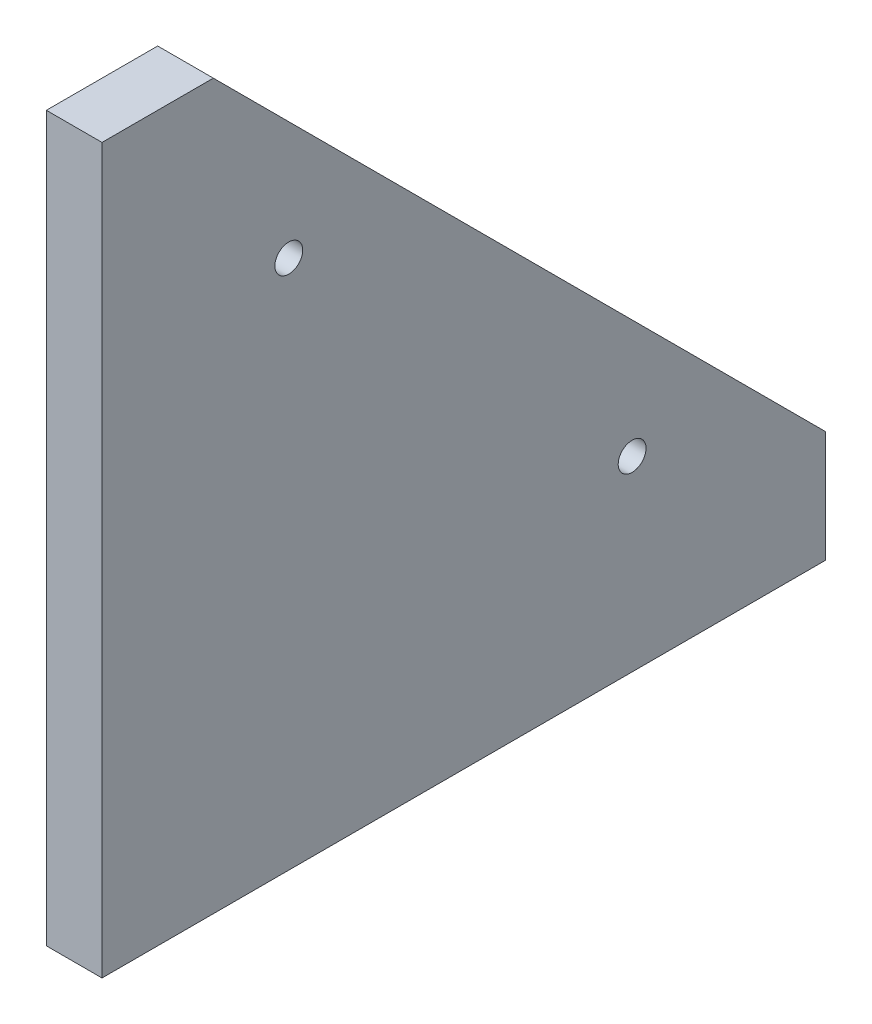
ISO-10303-21;
HEADER;
FILE_DESCRIPTION(('STEP AP214'),'2;1');
FILE_NAME('part.step','',(''),(''),'','','');
FILE_SCHEMA(('AUTOMOTIVE_DESIGN { 1 0 10303 214 1 1 1 1 }'));
ENDSEC;
DATA;
#1=APPLICATION_CONTEXT('core data for automotive mechanical design processes');
#2=APPLICATION_PROTOCOL_DEFINITION('international standard','automotive_design',2000,#1);
#3=PRODUCT_CONTEXT('',#1,'mechanical');
#4=PRODUCT('Part','Part','',(#3));
#5=PRODUCT_RELATED_PRODUCT_CATEGORY('part','',(#4));
#6=PRODUCT_DEFINITION_FORMATION('','',#4);
#7=PRODUCT_DEFINITION_CONTEXT('part definition',#1,'design');
#8=PRODUCT_DEFINITION('design','',#6,#7);
#9=PRODUCT_DEFINITION_SHAPE('','',#8);
#10=(LENGTH_UNIT() NAMED_UNIT(*) SI_UNIT(.MILLI.,.METRE.));
#11=(NAMED_UNIT(*) PLANE_ANGLE_UNIT() SI_UNIT($,.RADIAN.));
#12=(NAMED_UNIT(*) SI_UNIT($,.STERADIAN.) SOLID_ANGLE_UNIT());
#13=UNCERTAINTY_MEASURE_WITH_UNIT(LENGTH_MEASURE(1.E-05),#10,'distance_accuracy_value','');
#14=(GEOMETRIC_REPRESENTATION_CONTEXT(3) GLOBAL_UNCERTAINTY_ASSIGNED_CONTEXT((#13)) GLOBAL_UNIT_ASSIGNED_CONTEXT((#10,
#11,#12)) REPRESENTATION_CONTEXT('',''));
#15=CARTESIAN_POINT('',(0.,0.,0.));
#16=DIRECTION('',(0.,0.,1.));
#17=DIRECTION('',(1.,0.,0.));
#18=AXIS2_PLACEMENT_3D('',#15,#16,#17);
#19=CARTESIAN_POINT('',(2.5,65.,-9.99999999999999));
#20=DIRECTION('',(0.,-1.,0.));
#21=DIRECTION('',(0.,0.,-1.));
#22=AXIS2_PLACEMENT_3D('',#19,#20,#21);
#23=PLANE('',#22);
#24=DIRECTION('',(0.,0.,1.));
#25=VECTOR('',#24,1.);
#26=CARTESIAN_POINT('',(-2.5,65.,-9.99999999999999));
#27=LINE('',#26,#25);
#28=CARTESIAN_POINT('',(-2.5,65.,-9.99999999999999));
#29=VERTEX_POINT('',#28);
#30=CARTESIAN_POINT('',(-2.5,65.,0.));
#31=VERTEX_POINT('',#30);
#32=EDGE_CURVE('E110',#29,#31,#27,.T.);
#33=ORIENTED_EDGE('',*,*,#32,.T.);
#34=DIRECTION('',(-1.,0.,0.));
#35=VECTOR('',#34,1.);
#36=CARTESIAN_POINT('',(2.5,65.,0.));
#37=LINE('',#36,#35);
#38=CARTESIAN_POINT('',(2.5,65.,0.));
#39=VERTEX_POINT('',#38);
#40=EDGE_CURVE('E11',#39,#31,#37,.T.);
#41=ORIENTED_EDGE('',*,*,#40,.F.);
#42=DIRECTION('',(0.,0.,1.));
#43=VECTOR('',#42,1.);
#44=CARTESIAN_POINT('',(2.5,65.,-9.99999999999999));
#45=LINE('',#44,#43);
#46=CARTESIAN_POINT('',(2.5,65.,-9.99999999999999));
#47=VERTEX_POINT('',#46);
#48=EDGE_CURVE('E119',#47,#39,#45,.T.);
#49=ORIENTED_EDGE('',*,*,#48,.F.);
#50=DIRECTION('',(-1.,0.,0.));
#51=VECTOR('',#50,1.);
#52=CARTESIAN_POINT('',(2.5,65.,-9.99999999999999));
#53=LINE('',#52,#51);
#54=EDGE_CURVE('E106',#47,#29,#53,.T.);
#55=ORIENTED_EDGE('',*,*,#54,.T.);
#56=EDGE_LOOP('',(#33,#41,#49,#55));
#57=FACE_BOUND('',#56,.T.);
#58=ADVANCED_FACE('F36',(#57),#23,.F.);
#59=CARTESIAN_POINT('',(2.5,65.,0.));
#60=DIRECTION('',(0.,0.,-1.));
#61=DIRECTION('',(0.,1.,0.));
#62=AXIS2_PLACEMENT_3D('',#59,#60,#61);
#63=PLANE('',#62);
#64=DIRECTION('',(0.,-1.,0.));
#65=VECTOR('',#64,1.);
#66=CARTESIAN_POINT('',(-2.5,65.,0.));
#67=LINE('',#66,#65);
#68=CARTESIAN_POINT('',(-2.5,0.,0.));
#69=VERTEX_POINT('',#68);
#70=EDGE_CURVE('E113',#31,#69,#67,.T.);
#71=ORIENTED_EDGE('',*,*,#70,.T.);
#72=DIRECTION('',(-1.,0.,0.));
#73=VECTOR('',#72,1.);
#74=CARTESIAN_POINT('',(2.5,0.,0.));
#75=LINE('',#74,#73);
#76=CARTESIAN_POINT('',(2.5,0.,0.));
#77=VERTEX_POINT('',#76);
#78=EDGE_CURVE('E44',#77,#69,#75,.T.);
#79=ORIENTED_EDGE('',*,*,#78,.F.);
#80=DIRECTION('',(0.,-1.,0.));
#81=VECTOR('',#80,1.);
#82=CARTESIAN_POINT('',(2.5,65.,0.));
#83=LINE('',#82,#81);
#84=EDGE_CURVE('E86',#39,#77,#83,.T.);
#85=ORIENTED_EDGE('',*,*,#84,.F.);
#86=ORIENTED_EDGE('',*,*,#40,.T.);
#87=EDGE_LOOP('',(#71,#79,#85,#86));
#88=FACE_BOUND('',#87,.T.);
#89=ADVANCED_FACE('F139',(#88),#63,.F.);
#90=CARTESIAN_POINT('',(2.5,0.,0.));
#91=DIRECTION('',(0.,1.,0.));
#92=DIRECTION('',(0.,0.,1.));
#93=AXIS2_PLACEMENT_3D('',#90,#91,#92);
#94=PLANE('',#93);
#95=DIRECTION('',(0.,0.,-1.));
#96=VECTOR('',#95,1.);
#97=CARTESIAN_POINT('',(-2.5,0.,0.));
#98=LINE('',#97,#96);
#99=CARTESIAN_POINT('',(-2.5,0.,-65.));
#100=VERTEX_POINT('',#99);
#101=EDGE_CURVE('E101',#69,#100,#98,.T.);
#102=ORIENTED_EDGE('',*,*,#101,.T.);
#103=DIRECTION('',(-1.,0.,0.));
#104=VECTOR('',#103,1.);
#105=CARTESIAN_POINT('',(2.5,0.,-65.));
#106=LINE('',#105,#104);
#107=CARTESIAN_POINT('',(2.5,0.,-65.));
#108=VERTEX_POINT('',#107);
#109=EDGE_CURVE('E98',#108,#100,#106,.T.);
#110=ORIENTED_EDGE('',*,*,#109,.F.);
#111=DIRECTION('',(0.,0.,-1.));
#112=VECTOR('',#111,1.);
#113=CARTESIAN_POINT('',(2.5,0.,0.));
#114=LINE('',#113,#112);
#115=EDGE_CURVE('E90',#77,#108,#114,.T.);
#116=ORIENTED_EDGE('',*,*,#115,.F.);
#117=ORIENTED_EDGE('',*,*,#78,.T.);
#118=EDGE_LOOP('',(#102,#110,#116,#117));
#119=FACE_BOUND('',#118,.T.);
#120=ADVANCED_FACE('F99',(#119),#94,.F.);
#121=CARTESIAN_POINT('',(2.5,0.,-65.));
#122=DIRECTION('',(0.,0.,1.));
#123=DIRECTION('',(0.,-1.,0.));
#124=AXIS2_PLACEMENT_3D('',#121,#122,#123);
#125=PLANE('',#124);
#126=DIRECTION('',(0.,1.,0.));
#127=VECTOR('',#126,1.);
#128=CARTESIAN_POINT('',(-2.5,0.,-65.));
#129=LINE('',#128,#127);
#130=CARTESIAN_POINT('',(-2.5,10.,-65.));
#131=VERTEX_POINT('',#130);
#132=EDGE_CURVE('E72',#100,#131,#129,.T.);
#133=ORIENTED_EDGE('',*,*,#132,.T.);
#134=DIRECTION('',(-1.,0.,0.));
#135=VECTOR('',#134,1.);
#136=CARTESIAN_POINT('',(2.5,10.,-65.));
#137=LINE('',#136,#135);
#138=CARTESIAN_POINT('',(2.5,10.,-65.));
#139=VERTEX_POINT('',#138);
#140=EDGE_CURVE('E102',#139,#131,#137,.T.);
#141=ORIENTED_EDGE('',*,*,#140,.F.);
#142=DIRECTION('',(0.,1.,0.));
#143=VECTOR('',#142,1.);
#144=CARTESIAN_POINT('',(2.5,0.,-65.));
#145=LINE('',#144,#143);
#146=EDGE_CURVE('E94',#108,#139,#145,.T.);
#147=ORIENTED_EDGE('',*,*,#146,.F.);
#148=ORIENTED_EDGE('',*,*,#109,.T.);
#149=EDGE_LOOP('',(#133,#141,#147,#148));
#150=FACE_BOUND('',#149,.T.);
#151=ADVANCED_FACE('F104',(#150),#125,.F.);
#152=CARTESIAN_POINT('',(2.5,10.,-65.));
#153=DIRECTION('',(0.,-0.707106781186548,0.707106781186547));
#154=DIRECTION('',(0.,-0.707106781186547,-0.707106781186548));
#155=AXIS2_PLACEMENT_3D('',#152,#153,#154);
#156=PLANE('',#155);
#157=DIRECTION('',(0.,0.707106781186547,0.707106781186548));
#158=VECTOR('',#157,1.);
#159=CARTESIAN_POINT('',(-2.5,10.,-65.));
#160=LINE('',#159,#158);
#161=EDGE_CURVE('E78',#131,#29,#160,.T.);
#162=ORIENTED_EDGE('',*,*,#161,.T.);
#163=ORIENTED_EDGE('',*,*,#54,.F.);
#164=DIRECTION('',(0.,0.707106781186547,0.707106781186548));
#165=VECTOR('',#164,1.);
#166=CARTESIAN_POINT('',(2.5,10.,-65.));
#167=LINE('',#166,#165);
#168=EDGE_CURVE('E52',#139,#47,#167,.T.);
#169=ORIENTED_EDGE('',*,*,#168,.F.);
#170=ORIENTED_EDGE('',*,*,#140,.T.);
#171=EDGE_LOOP('',(#162,#163,#169,#170));
#172=FACE_BOUND('',#171,.T.);
#173=ADVANCED_FACE('F127',(#172),#156,.F.);
#174=CARTESIAN_POINT('',(2.5,0.,0.));
#175=DIRECTION('',(1.,0.,0.));
#176=DIRECTION('',(0.,0.,-1.));
#177=AXIS2_PLACEMENT_3D('',#174,#175,#176);
#178=PLANE('',#177);
#179=CARTESIAN_POINT('',(2.5,47.6176604143557,-16.775737867846));
#180=DIRECTION('',(1.,0.,0.));
#181=DIRECTION('',(0.,0.,-1.));
#182=AXIS2_PLACEMENT_3D('',#179,#180,#181);
#183=CIRCLE('',#182,1.24999999999999);
#184=CARTESIAN_POINT('',(2.5,47.6176604143557,-18.025737867846));
#185=VERTEX_POINT('',#184);
#186=EDGE_CURVE('E221',#185,#185,#183,.T.);
#187=ORIENTED_EDGE('',*,*,#186,.F.);
#188=EDGE_LOOP('',(#187));
#189=FACE_BOUND('',#188,.T.);
#190=CARTESIAN_POINT('',(2.5,16.775737867846,-47.6176604143557));
#191=DIRECTION('',(1.,0.,0.));
#192=DIRECTION('',(0.,0.,-1.));
#193=AXIS2_PLACEMENT_3D('',#190,#191,#192);
#194=CIRCLE('',#193,1.24999999999999);
#195=CARTESIAN_POINT('',(2.5,16.775737867846,-48.8676604143557));
#196=VERTEX_POINT('',#195);
#197=EDGE_CURVE('E231',#196,#196,#194,.T.);
#198=ORIENTED_EDGE('',*,*,#197,.F.);
#199=EDGE_LOOP('',(#198));
#200=FACE_BOUND('',#199,.T.);
#201=ORIENTED_EDGE('',*,*,#48,.T.);
#202=ORIENTED_EDGE('',*,*,#84,.T.);
#203=ORIENTED_EDGE('',*,*,#115,.T.);
#204=ORIENTED_EDGE('',*,*,#146,.T.);
#205=ORIENTED_EDGE('',*,*,#168,.T.);
#206=EDGE_LOOP('',(#201,#202,#203,#204,#205));
#207=FACE_BOUND('',#206,.T.);
#208=ADVANCED_FACE('F92',(#189,#200,#207),#178,.T.);
#209=CARTESIAN_POINT('',(-2.5,0.,0.));
#210=DIRECTION('',(1.,0.,0.));
#211=DIRECTION('',(0.,0.,-1.));
#212=AXIS2_PLACEMENT_3D('',#209,#210,#211);
#213=PLANE('',#212);
#214=CARTESIAN_POINT('',(-2.5,47.6176604143557,-16.775737867846));
#215=DIRECTION('',(1.,0.,0.));
#216=DIRECTION('',(0.,0.,-1.));
#217=AXIS2_PLACEMENT_3D('',#214,#215,#216);
#218=CIRCLE('',#217,1.275);
#219=CARTESIAN_POINT('',(-2.5,47.6176604143557,-18.050737867846));
#220=VERTEX_POINT('',#219);
#221=EDGE_CURVE('E222',#220,#220,#218,.T.);
#222=ORIENTED_EDGE('',*,*,#221,.T.);
#223=EDGE_LOOP('',(#222));
#224=FACE_BOUND('',#223,.T.);
#225=CARTESIAN_POINT('',(-2.5,16.775737867846,-47.6176604143557));
#226=DIRECTION('',(1.,0.,0.));
#227=DIRECTION('',(0.,0.,-1.));
#228=AXIS2_PLACEMENT_3D('',#225,#226,#227);
#229=CIRCLE('',#228,1.275);
#230=CARTESIAN_POINT('',(-2.5,16.775737867846,-48.8926604143557));
#231=VERTEX_POINT('',#230);
#232=EDGE_CURVE('E224',#231,#231,#229,.T.);
#233=ORIENTED_EDGE('',*,*,#232,.T.);
#234=EDGE_LOOP('',(#233));
#235=FACE_BOUND('',#234,.T.);
#236=ORIENTED_EDGE('',*,*,#32,.F.);
#237=ORIENTED_EDGE('',*,*,#161,.F.);
#238=ORIENTED_EDGE('',*,*,#132,.F.);
#239=ORIENTED_EDGE('',*,*,#101,.F.);
#240=ORIENTED_EDGE('',*,*,#70,.F.);
#241=EDGE_LOOP('',(#236,#237,#238,#239,#240));
#242=FACE_BOUND('',#241,.T.);
#243=ADVANCED_FACE('F123',(#224,#235,#242),#213,.F.);
#244=CARTESIAN_POINT('',(-2.475,16.775737867846,-47.6176604143557));
#245=DIRECTION('',(-1.,0.,0.));
#246=DIRECTION('',(0.,0.,1.));
#247=AXIS2_PLACEMENT_3D('',#244,#245,#246);
#248=CONICAL_SURFACE('',#247,1.25,0.785398163397483);
#249=ORIENTED_EDGE('',*,*,#232,.F.);
#250=EDGE_LOOP('',(#249));
#251=FACE_BOUND('',#250,.T.);
#252=CARTESIAN_POINT('',(-2.475,16.775737867846,-47.6176604143557));
#253=DIRECTION('',(1.,0.,0.));
#254=DIRECTION('',(0.,0.,-1.));
#255=AXIS2_PLACEMENT_3D('',#252,#253,#254);
#256=CIRCLE('',#255,1.25);
#257=CARTESIAN_POINT('',(-2.475,16.775737867846,-48.8676604143557));
#258=VERTEX_POINT('',#257);
#259=EDGE_CURVE('E114',#258,#258,#256,.T.);
#260=ORIENTED_EDGE('',*,*,#259,.T.);
#261=EDGE_LOOP('',(#260));
#262=FACE_BOUND('',#261,.T.);
#263=ADVANCED_FACE('F172',(#251,#262),#248,.F.);
#264=CARTESIAN_POINT('',(2.5,16.775737867846,-47.6176604143557));
#265=DIRECTION('',(1.,0.,0.));
#266=DIRECTION('',(0.,0.,-1.));
#267=AXIS2_PLACEMENT_3D('',#264,#265,#266);
#268=CYLINDRICAL_SURFACE('',#267,1.24999999999999);
#269=ORIENTED_EDGE('',*,*,#259,.F.);
#270=EDGE_LOOP('',(#269));
#271=FACE_BOUND('',#270,.T.);
#272=ORIENTED_EDGE('',*,*,#197,.T.);
#273=EDGE_LOOP('',(#272));
#274=FACE_BOUND('',#273,.T.);
#275=ADVANCED_FACE('F181',(#271,#274),#268,.F.);
#276=CARTESIAN_POINT('',(-2.475,47.6176604143557,-16.775737867846));
#277=DIRECTION('',(-1.,0.,0.));
#278=DIRECTION('',(0.,0.,1.));
#279=AXIS2_PLACEMENT_3D('',#276,#277,#278);
#280=CONICAL_SURFACE('',#279,1.25,0.785398163397414);
#281=ORIENTED_EDGE('',*,*,#221,.F.);
#282=EDGE_LOOP('',(#281));
#283=FACE_BOUND('',#282,.T.);
#284=CARTESIAN_POINT('',(-2.475,47.6176604143557,-16.775737867846));
#285=DIRECTION('',(1.,0.,0.));
#286=DIRECTION('',(0.,0.,-1.));
#287=AXIS2_PLACEMENT_3D('',#284,#285,#286);
#288=CIRCLE('',#287,1.25);
#289=CARTESIAN_POINT('',(-2.475,47.6176604143557,-18.025737867846));
#290=VERTEX_POINT('',#289);
#291=EDGE_CURVE('E218',#290,#290,#288,.T.);
#292=ORIENTED_EDGE('',*,*,#291,.T.);
#293=EDGE_LOOP('',(#292));
#294=FACE_BOUND('',#293,.T.);
#295=ADVANCED_FACE('F191',(#283,#294),#280,.F.);
#296=CARTESIAN_POINT('',(2.5,47.6176604143557,-16.775737867846));
#297=DIRECTION('',(1.,0.,0.));
#298=DIRECTION('',(0.,0.,-1.));
#299=AXIS2_PLACEMENT_3D('',#296,#297,#298);
#300=CYLINDRICAL_SURFACE('',#299,1.24999999999999);
#301=ORIENTED_EDGE('',*,*,#291,.F.);
#302=EDGE_LOOP('',(#301));
#303=FACE_BOUND('',#302,.T.);
#304=ORIENTED_EDGE('',*,*,#186,.T.);
#305=EDGE_LOOP('',(#304));
#306=FACE_BOUND('',#305,.T.);
#307=ADVANCED_FACE('F201',(#303,#306),#300,.F.);
#308=CLOSED_SHELL('',(#58,#89,#120,#151,#173,#208,#243,#263,#275,#295,#307));
#309=MANIFOLD_SOLID_BREP('B2',#308);
#310=ADVANCED_BREP_SHAPE_REPRESENTATION('',(#18,#309),#14);
#311=SHAPE_DEFINITION_REPRESENTATION(#9,#310);
ENDSEC;
END-ISO-10303-21;
